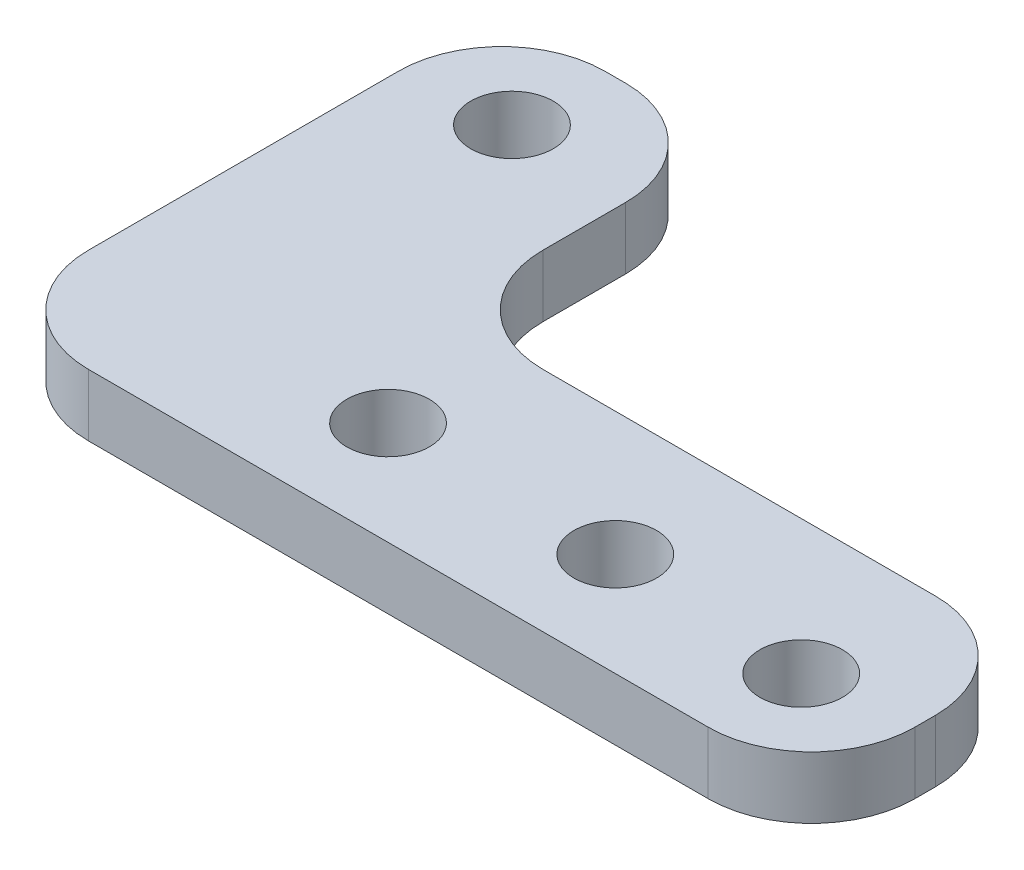
ISO-10303-21;
HEADER;
FILE_DESCRIPTION(('STEP AP214'),'2;1');
FILE_NAME('part.step','',(''),(''),'','','');
FILE_SCHEMA(('AUTOMOTIVE_DESIGN { 1 0 10303 214 1 1 1 1 }'));
ENDSEC;
DATA;
#1=APPLICATION_CONTEXT('core data for automotive mechanical design processes');
#2=APPLICATION_PROTOCOL_DEFINITION('international standard','automotive_design',2000,#1);
#3=PRODUCT_CONTEXT('',#1,'mechanical');
#4=PRODUCT('Part','Part','',(#3));
#5=PRODUCT_RELATED_PRODUCT_CATEGORY('part','',(#4));
#6=PRODUCT_DEFINITION_FORMATION('','',#4);
#7=PRODUCT_DEFINITION_CONTEXT('part definition',#1,'design');
#8=PRODUCT_DEFINITION('design','',#6,#7);
#9=PRODUCT_DEFINITION_SHAPE('','',#8);
#10=(LENGTH_UNIT() NAMED_UNIT(*) SI_UNIT(.MILLI.,.METRE.));
#11=(NAMED_UNIT(*) PLANE_ANGLE_UNIT() SI_UNIT($,.RADIAN.));
#12=(NAMED_UNIT(*) SI_UNIT($,.STERADIAN.) SOLID_ANGLE_UNIT());
#13=UNCERTAINTY_MEASURE_WITH_UNIT(LENGTH_MEASURE(1.E-05),#10,'distance_accuracy_value','');
#14=(GEOMETRIC_REPRESENTATION_CONTEXT(3) GLOBAL_UNCERTAINTY_ASSIGNED_CONTEXT((#13)) GLOBAL_UNIT_ASSIGNED_CONTEXT((#10,
#11,#12)) REPRESENTATION_CONTEXT('',''));
#15=CARTESIAN_POINT('',(0.,0.,0.));
#16=DIRECTION('',(0.,0.,1.));
#17=DIRECTION('',(1.,0.,0.));
#18=AXIS2_PLACEMENT_3D('',#15,#16,#17);
#19=CARTESIAN_POINT('',(-20.,3.,12.5));
#20=DIRECTION('',(1.,0.,0.));
#21=DIRECTION('',(0.,0.,-1.));
#22=AXIS2_PLACEMENT_3D('',#19,#20,#21);
#23=PLANE('',#22);
#24=DIRECTION('',(0.,0.,1.));
#25=VECTOR('',#24,1.);
#26=CARTESIAN_POINT('',(-20.,3.,12.5));
#27=LINE('',#26,#25);
#28=CARTESIAN_POINT('',(-20.,3.,-7.5));
#29=VERTEX_POINT('',#28);
#30=CARTESIAN_POINT('',(-20.,3.,7.50000000000001));
#31=VERTEX_POINT('',#30);
#32=EDGE_CURVE('E151',#29,#31,#27,.T.);
#33=ORIENTED_EDGE('',*,*,#32,.F.);
#34=DIRECTION('',(0.,-1.,0.));
#35=VECTOR('',#34,1.);
#36=CARTESIAN_POINT('',(-20.,3.,-7.5));
#37=LINE('',#36,#35);
#38=CARTESIAN_POINT('',(-20.,0.,-7.5));
#39=VERTEX_POINT('',#38);
#40=EDGE_CURVE('E185',#29,#39,#37,.T.);
#41=ORIENTED_EDGE('',*,*,#40,.T.);
#42=DIRECTION('',(0.,0.,1.));
#43=VECTOR('',#42,1.);
#44=CARTESIAN_POINT('',(-20.,0.,12.5));
#45=LINE('',#44,#43);
#46=CARTESIAN_POINT('',(-20.,0.,7.50000000000001));
#47=VERTEX_POINT('',#46);
#48=EDGE_CURVE('E153',#39,#47,#45,.T.);
#49=ORIENTED_EDGE('',*,*,#48,.T.);
#50=DIRECTION('',(0.,-1.,0.));
#51=VECTOR('',#50,1.);
#52=CARTESIAN_POINT('',(-20.,3.,7.50000000000001));
#53=LINE('',#52,#51);
#54=EDGE_CURVE('E183',#47,#31,#53,.F.);
#55=ORIENTED_EDGE('',*,*,#54,.T.);
#56=EDGE_LOOP('',(#33,#41,#49,#55));
#57=FACE_BOUND('',#56,.T.);
#58=ADVANCED_FACE('F33',(#57),#23,.F.);
#59=CARTESIAN_POINT('',(20.,3.,12.5));
#60=DIRECTION('',(0.,0.,-1.));
#61=DIRECTION('',(-1.,0.,0.));
#62=AXIS2_PLACEMENT_3D('',#59,#60,#61);
#63=PLANE('',#62);
#64=DIRECTION('',(1.,0.,0.));
#65=VECTOR('',#64,1.);
#66=CARTESIAN_POINT('',(20.,0.,12.5));
#67=LINE('',#66,#65);
#68=CARTESIAN_POINT('',(-15.,0.,12.5));
#69=VERTEX_POINT('',#68);
#70=CARTESIAN_POINT('',(15.,0.,12.5));
#71=VERTEX_POINT('',#70);
#72=EDGE_CURVE('E149',#69,#71,#67,.T.);
#73=ORIENTED_EDGE('',*,*,#72,.T.);
#74=DIRECTION('',(0.,-1.,0.));
#75=VECTOR('',#74,1.);
#76=CARTESIAN_POINT('',(15.,3.,12.5));
#77=LINE('',#76,#75);
#78=CARTESIAN_POINT('',(15.,3.,12.5));
#79=VERTEX_POINT('',#78);
#80=EDGE_CURVE('E127',#71,#79,#77,.F.);
#81=ORIENTED_EDGE('',*,*,#80,.T.);
#82=DIRECTION('',(1.,0.,0.));
#83=VECTOR('',#82,1.);
#84=CARTESIAN_POINT('',(20.,3.,12.5));
#85=LINE('',#84,#83);
#86=CARTESIAN_POINT('',(-15.,3.,12.5));
#87=VERTEX_POINT('',#86);
#88=EDGE_CURVE('E251',#87,#79,#85,.T.);
#89=ORIENTED_EDGE('',*,*,#88,.F.);
#90=DIRECTION('',(0.,-1.,0.));
#91=VECTOR('',#90,1.);
#92=CARTESIAN_POINT('',(-15.,3.,12.5));
#93=LINE('',#92,#91);
#94=EDGE_CURVE('E179',#87,#69,#93,.T.);
#95=ORIENTED_EDGE('',*,*,#94,.T.);
#96=EDGE_LOOP('',(#73,#81,#89,#95));
#97=FACE_BOUND('',#96,.T.);
#98=ADVANCED_FACE('F266',(#97),#63,.F.);
#99=CARTESIAN_POINT('',(20.,3.,12.5));
#100=DIRECTION('',(-1.,0.,0.));
#101=DIRECTION('',(0.,0.,1.));
#102=AXIS2_PLACEMENT_3D('',#99,#100,#101);
#103=PLANE('',#102);
#104=DIRECTION('',(0.,0.,-1.));
#105=VECTOR('',#104,1.);
#106=CARTESIAN_POINT('',(20.,0.,12.5));
#107=LINE('',#106,#105);
#108=CARTESIAN_POINT('',(20.,0.,7.5));
#109=VERTEX_POINT('',#108);
#110=CARTESIAN_POINT('',(20.,0.,6.50000000000001));
#111=VERTEX_POINT('',#110);
#112=EDGE_CURVE('E138',#109,#111,#107,.T.);
#113=ORIENTED_EDGE('',*,*,#112,.T.);
#114=DIRECTION('',(0.,1.,0.));
#115=VECTOR('',#114,1.);
#116=CARTESIAN_POINT('',(20.,3.,6.50000000000001));
#117=LINE('',#116,#115);
#118=CARTESIAN_POINT('',(20.,3.,6.50000000000001));
#119=VERTEX_POINT('',#118);
#120=EDGE_CURVE('E142',#111,#119,#117,.T.);
#121=ORIENTED_EDGE('',*,*,#120,.T.);
#122=DIRECTION('',(0.,0.,-1.));
#123=VECTOR('',#122,1.);
#124=CARTESIAN_POINT('',(20.,3.,12.5));
#125=LINE('',#124,#123);
#126=CARTESIAN_POINT('',(20.,3.,7.5));
#127=VERTEX_POINT('',#126);
#128=EDGE_CURVE('E141',#127,#119,#125,.T.);
#129=ORIENTED_EDGE('',*,*,#128,.F.);
#130=DIRECTION('',(0.,-1.,0.));
#131=VECTOR('',#130,1.);
#132=CARTESIAN_POINT('',(20.,3.,7.5));
#133=LINE('',#132,#131);
#134=EDGE_CURVE('E126',#127,#109,#133,.T.);
#135=ORIENTED_EDGE('',*,*,#134,.T.);
#136=EDGE_LOOP('',(#113,#121,#129,#135));
#137=FACE_BOUND('',#136,.T.);
#138=ADVANCED_FACE('F136',(#137),#103,.F.);
#139=CARTESIAN_POINT('',(20.,3.,-12.5));
#140=DIRECTION('',(0.,0.,1.));
#141=DIRECTION('',(1.,0.,0.));
#142=AXIS2_PLACEMENT_3D('',#139,#140,#141);
#143=PLANE('',#142);
#144=DIRECTION('',(-1.,0.,0.));
#145=VECTOR('',#144,1.);
#146=CARTESIAN_POINT('',(20.,0.,-12.5));
#147=LINE('',#146,#145);
#148=CARTESIAN_POINT('',(-14.,0.,-12.5));
#149=VERTEX_POINT('',#148);
#150=CARTESIAN_POINT('',(-15.,0.,-12.5));
#151=VERTEX_POINT('',#150);
#152=EDGE_CURVE('E148',#149,#151,#147,.T.);
#153=ORIENTED_EDGE('',*,*,#152,.T.);
#154=DIRECTION('',(0.,-1.,0.));
#155=VECTOR('',#154,1.);
#156=CARTESIAN_POINT('',(-15.,3.,-12.5));
#157=LINE('',#156,#155);
#158=CARTESIAN_POINT('',(-15.,3.,-12.5));
#159=VERTEX_POINT('',#158);
#160=EDGE_CURVE('E189',#151,#159,#157,.F.);
#161=ORIENTED_EDGE('',*,*,#160,.T.);
#162=DIRECTION('',(-1.,0.,0.));
#163=VECTOR('',#162,1.);
#164=CARTESIAN_POINT('',(20.,3.,-12.5));
#165=LINE('',#164,#163);
#166=CARTESIAN_POINT('',(-14.,3.,-12.5));
#167=VERTEX_POINT('',#166);
#168=EDGE_CURVE('E143',#167,#159,#165,.T.);
#169=ORIENTED_EDGE('',*,*,#168,.F.);
#170=DIRECTION('',(0.,1.,0.));
#171=VECTOR('',#170,1.);
#172=CARTESIAN_POINT('',(-14.,3.,-12.5));
#173=LINE('',#172,#171);
#174=EDGE_CURVE('E55',#167,#149,#173,.F.);
#175=ORIENTED_EDGE('',*,*,#174,.T.);
#176=EDGE_LOOP('',(#153,#161,#169,#175));
#177=FACE_BOUND('',#176,.T.);
#178=ADVANCED_FACE('F273',(#177),#143,.F.);
#179=CARTESIAN_POINT('',(0.,3.,0.));
#180=DIRECTION('',(0.,1.,0.));
#181=DIRECTION('',(0.,0.,1.));
#182=AXIS2_PLACEMENT_3D('',#179,#180,#181);
#183=PLANE('',#182);
#184=ORIENTED_EDGE('',*,*,#128,.T.);
#185=CARTESIAN_POINT('',(15.,3.,6.50000000000001));
#186=DIRECTION('',(0.,1.,0.));
#187=DIRECTION('',(0.,0.,1.));
#188=AXIS2_PLACEMENT_3D('',#185,#186,#187);
#189=CIRCLE('',#188,5.);
#190=CARTESIAN_POINT('',(15.,3.,1.5));
#191=VERTEX_POINT('',#190);
#192=EDGE_CURVE('E166',#119,#191,#189,.T.);
#193=ORIENTED_EDGE('',*,*,#192,.T.);
#194=DIRECTION('',(1.,0.,0.));
#195=VECTOR('',#194,1.);
#196=CARTESIAN_POINT('',(-9.,3.,1.50000000000001));
#197=LINE('',#196,#195);
#198=CARTESIAN_POINT('',(-4.,3.,1.50000000000001));
#199=VERTEX_POINT('',#198);
#200=EDGE_CURVE('E203',#199,#191,#197,.T.);
#201=ORIENTED_EDGE('',*,*,#200,.F.);
#202=CARTESIAN_POINT('',(-4.,3.,-3.49999999999999));
#203=DIRECTION('',(0.,1.,0.));
#204=DIRECTION('',(0.,0.,1.));
#205=AXIS2_PLACEMENT_3D('',#202,#203,#204);
#206=CIRCLE('',#205,5.);
#207=CARTESIAN_POINT('',(-9.,3.,-3.49999999999999));
#208=VERTEX_POINT('',#207);
#209=EDGE_CURVE('E41',#199,#208,#206,.F.);
#210=ORIENTED_EDGE('',*,*,#209,.T.);
#211=DIRECTION('',(0.,0.,1.));
#212=VECTOR('',#211,1.);
#213=CARTESIAN_POINT('',(-9.,3.,-12.5));
#214=LINE('',#213,#212);
#215=CARTESIAN_POINT('',(-9.,3.,-7.5));
#216=VERTEX_POINT('',#215);
#217=EDGE_CURVE('E201',#216,#208,#214,.T.);
#218=ORIENTED_EDGE('',*,*,#217,.F.);
#219=CARTESIAN_POINT('',(-14.,3.,-7.5));
#220=DIRECTION('',(0.,1.,0.));
#221=DIRECTION('',(0.,0.,1.));
#222=AXIS2_PLACEMENT_3D('',#219,#220,#221);
#223=CIRCLE('',#222,5.);
#224=EDGE_CURVE('E160',#216,#167,#223,.T.);
#225=ORIENTED_EDGE('',*,*,#224,.T.);
#226=ORIENTED_EDGE('',*,*,#168,.T.);
#227=CARTESIAN_POINT('',(-15.,3.,-7.5));
#228=DIRECTION('',(0.,1.,0.));
#229=DIRECTION('',(0.,0.,1.));
#230=AXIS2_PLACEMENT_3D('',#227,#228,#229);
#231=CIRCLE('',#230,5.);
#232=EDGE_CURVE('E162',#159,#29,#231,.T.);
#233=ORIENTED_EDGE('',*,*,#232,.T.);
#234=ORIENTED_EDGE('',*,*,#32,.T.);
#235=CARTESIAN_POINT('',(-15.,3.,7.50000000000001));
#236=DIRECTION('',(0.,1.,0.));
#237=DIRECTION('',(0.,0.,1.));
#238=AXIS2_PLACEMENT_3D('',#235,#236,#237);
#239=CIRCLE('',#238,5.);
#240=EDGE_CURVE('E158',#31,#87,#239,.T.);
#241=ORIENTED_EDGE('',*,*,#240,.T.);
#242=ORIENTED_EDGE('',*,*,#88,.T.);
#243=CARTESIAN_POINT('',(15.,3.,7.5));
#244=DIRECTION('',(0.,1.,0.));
#245=DIRECTION('',(0.,0.,1.));
#246=AXIS2_PLACEMENT_3D('',#243,#244,#245);
#247=CIRCLE('',#246,5.);
#248=EDGE_CURVE('E164',#79,#127,#247,.T.);
#249=ORIENTED_EDGE('',*,*,#248,.T.);
#250=EDGE_LOOP('',(#184,#193,#201,#210,#218,#225,#226,#233,#234,#241,#242,#249));
#251=FACE_BOUND('',#250,.T.);
#252=CARTESIAN_POINT('',(-5.5,3.,7.50000000000001));
#253=DIRECTION('',(0.,1.,0.));
#254=DIRECTION('',(0.,0.,1.));
#255=AXIS2_PLACEMENT_3D('',#252,#253,#254);
#256=CIRCLE('',#255,1.99999999999999);
#257=CARTESIAN_POINT('',(-5.5,3.,9.49999999999999));
#258=VERTEX_POINT('',#257);
#259=EDGE_CURVE('E221',#258,#258,#256,.T.);
#260=ORIENTED_EDGE('',*,*,#259,.F.);
#261=EDGE_LOOP('',(#260));
#262=FACE_BOUND('',#261,.T.);
#263=CARTESIAN_POINT('',(5.5,3.,7.50000000000001));
#264=DIRECTION('',(0.,1.,0.));
#265=DIRECTION('',(0.,0.,1.));
#266=AXIS2_PLACEMENT_3D('',#263,#264,#265);
#267=CIRCLE('',#266,1.99999999999999);
#268=CARTESIAN_POINT('',(5.5,3.,9.49999999999999));
#269=VERTEX_POINT('',#268);
#270=EDGE_CURVE('E231',#269,#269,#267,.T.);
#271=ORIENTED_EDGE('',*,*,#270,.F.);
#272=EDGE_LOOP('',(#271));
#273=FACE_BOUND('',#272,.T.);
#274=CARTESIAN_POINT('',(-15.,3.,-8.));
#275=DIRECTION('',(0.,1.,0.));
#276=DIRECTION('',(0.,0.,1.));
#277=AXIS2_PLACEMENT_3D('',#274,#275,#276);
#278=CIRCLE('',#277,1.99999999999999);
#279=CARTESIAN_POINT('',(-15.,3.,-6.00000000000001));
#280=VERTEX_POINT('',#279);
#281=EDGE_CURVE('E237',#280,#280,#278,.T.);
#282=ORIENTED_EDGE('',*,*,#281,.F.);
#283=EDGE_LOOP('',(#282));
#284=FACE_BOUND('',#283,.T.);
#285=CARTESIAN_POINT('',(15.,3.,8.));
#286=DIRECTION('',(0.,1.,0.));
#287=DIRECTION('',(0.,0.,1.));
#288=AXIS2_PLACEMENT_3D('',#285,#286,#287);
#289=CIRCLE('',#288,1.99999999999999);
#290=CARTESIAN_POINT('',(15.,3.,9.99999999999998));
#291=VERTEX_POINT('',#290);
#292=EDGE_CURVE('E243',#291,#291,#289,.T.);
#293=ORIENTED_EDGE('',*,*,#292,.F.);
#294=EDGE_LOOP('',(#293));
#295=FACE_BOUND('',#294,.T.);
#296=ADVANCED_FACE('F199',(#251,#262,#273,#284,#295),#183,.T.);
#297=CARTESIAN_POINT('',(0.,0.,0.));
#298=DIRECTION('',(0.,1.,0.));
#299=DIRECTION('',(0.,0.,1.));
#300=AXIS2_PLACEMENT_3D('',#297,#298,#299);
#301=PLANE('',#300);
#302=CARTESIAN_POINT('',(-5.5,0.,7.50000000000001));
#303=DIRECTION('',(0.,1.,0.));
#304=DIRECTION('',(0.,0.,1.));
#305=AXIS2_PLACEMENT_3D('',#302,#303,#304);
#306=CIRCLE('',#305,2.);
#307=CARTESIAN_POINT('',(-5.5,0.,9.50000000000001));
#308=VERTEX_POINT('',#307);
#309=EDGE_CURVE('E224',#308,#308,#306,.T.);
#310=ORIENTED_EDGE('',*,*,#309,.T.);
#311=EDGE_LOOP('',(#310));
#312=FACE_BOUND('',#311,.T.);
#313=CARTESIAN_POINT('',(5.5,0.,7.50000000000001));
#314=DIRECTION('',(0.,1.,0.));
#315=DIRECTION('',(0.,0.,1.));
#316=AXIS2_PLACEMENT_3D('',#313,#314,#315);
#317=CIRCLE('',#316,2.);
#318=CARTESIAN_POINT('',(5.5,0.,9.5));
#319=VERTEX_POINT('',#318);
#320=EDGE_CURVE('E234',#319,#319,#317,.T.);
#321=ORIENTED_EDGE('',*,*,#320,.T.);
#322=EDGE_LOOP('',(#321));
#323=FACE_BOUND('',#322,.T.);
#324=CARTESIAN_POINT('',(-15.,0.,-8.));
#325=DIRECTION('',(0.,1.,0.));
#326=DIRECTION('',(0.,0.,1.));
#327=AXIS2_PLACEMENT_3D('',#324,#325,#326);
#328=CIRCLE('',#327,2.);
#329=CARTESIAN_POINT('',(-15.,0.,-6.));
#330=VERTEX_POINT('',#329);
#331=EDGE_CURVE('E240',#330,#330,#328,.T.);
#332=ORIENTED_EDGE('',*,*,#331,.T.);
#333=EDGE_LOOP('',(#332));
#334=FACE_BOUND('',#333,.T.);
#335=CARTESIAN_POINT('',(15.,0.,8.));
#336=DIRECTION('',(0.,1.,0.));
#337=DIRECTION('',(0.,0.,1.));
#338=AXIS2_PLACEMENT_3D('',#335,#336,#337);
#339=CIRCLE('',#338,2.);
#340=CARTESIAN_POINT('',(15.,0.,10.));
#341=VERTEX_POINT('',#340);
#342=EDGE_CURVE('E246',#341,#341,#339,.T.);
#343=ORIENTED_EDGE('',*,*,#342,.T.);
#344=EDGE_LOOP('',(#343));
#345=FACE_BOUND('',#344,.T.);
#346=DIRECTION('',(1.,0.,0.));
#347=VECTOR('',#346,1.);
#348=CARTESIAN_POINT('',(-9.,0.,1.50000000000001));
#349=LINE('',#348,#347);
#350=CARTESIAN_POINT('',(-4.,0.,1.50000000000001));
#351=VERTEX_POINT('',#350);
#352=CARTESIAN_POINT('',(15.,0.,1.5));
#353=VERTEX_POINT('',#352);
#354=EDGE_CURVE('E216',#351,#353,#349,.T.);
#355=ORIENTED_EDGE('',*,*,#354,.T.);
#356=CARTESIAN_POINT('',(15.,0.,6.50000000000001));
#357=DIRECTION('',(0.,1.,0.));
#358=DIRECTION('',(0.,0.,1.));
#359=AXIS2_PLACEMENT_3D('',#356,#357,#358);
#360=CIRCLE('',#359,5.);
#361=EDGE_CURVE('E131',#353,#111,#360,.F.);
#362=ORIENTED_EDGE('',*,*,#361,.T.);
#363=ORIENTED_EDGE('',*,*,#112,.F.);
#364=CARTESIAN_POINT('',(15.,0.,7.5));
#365=DIRECTION('',(0.,1.,0.));
#366=DIRECTION('',(0.,0.,1.));
#367=AXIS2_PLACEMENT_3D('',#364,#365,#366);
#368=CIRCLE('',#367,5.);
#369=EDGE_CURVE('E122',#109,#71,#368,.F.);
#370=ORIENTED_EDGE('',*,*,#369,.T.);
#371=ORIENTED_EDGE('',*,*,#72,.F.);
#372=CARTESIAN_POINT('',(-15.,0.,7.50000000000001));
#373=DIRECTION('',(0.,1.,0.));
#374=DIRECTION('',(0.,0.,1.));
#375=AXIS2_PLACEMENT_3D('',#372,#373,#374);
#376=CIRCLE('',#375,5.);
#377=EDGE_CURVE('E173',#69,#47,#376,.F.);
#378=ORIENTED_EDGE('',*,*,#377,.T.);
#379=ORIENTED_EDGE('',*,*,#48,.F.);
#380=CARTESIAN_POINT('',(-15.,0.,-7.5));
#381=DIRECTION('',(0.,1.,0.));
#382=DIRECTION('',(0.,0.,1.));
#383=AXIS2_PLACEMENT_3D('',#380,#381,#382);
#384=CIRCLE('',#383,5.);
#385=EDGE_CURVE('E48',#39,#151,#384,.F.);
#386=ORIENTED_EDGE('',*,*,#385,.T.);
#387=ORIENTED_EDGE('',*,*,#152,.F.);
#388=CARTESIAN_POINT('',(-14.,0.,-7.5));
#389=DIRECTION('',(0.,1.,0.));
#390=DIRECTION('',(0.,0.,1.));
#391=AXIS2_PLACEMENT_3D('',#388,#389,#390);
#392=CIRCLE('',#391,5.);
#393=CARTESIAN_POINT('',(-9.,0.,-7.5));
#394=VERTEX_POINT('',#393);
#395=EDGE_CURVE('E175',#149,#394,#392,.F.);
#396=ORIENTED_EDGE('',*,*,#395,.T.);
#397=DIRECTION('',(0.,0.,1.));
#398=VECTOR('',#397,1.);
#399=CARTESIAN_POINT('',(-9.,0.,-12.5));
#400=LINE('',#399,#398);
#401=CARTESIAN_POINT('',(-9.,0.,-3.49999999999999));
#402=VERTEX_POINT('',#401);
#403=EDGE_CURVE('E217',#394,#402,#400,.T.);
#404=ORIENTED_EDGE('',*,*,#403,.T.);
#405=CARTESIAN_POINT('',(-4.,0.,-3.49999999999999));
#406=DIRECTION('',(0.,1.,0.));
#407=DIRECTION('',(0.,0.,1.));
#408=AXIS2_PLACEMENT_3D('',#405,#406,#407);
#409=CIRCLE('',#408,5.);
#410=EDGE_CURVE('E11',#402,#351,#409,.T.);
#411=ORIENTED_EDGE('',*,*,#410,.T.);
#412=EDGE_LOOP('',(#355,#362,#363,#370,#371,#378,#379,#386,#387,#396,#404,#411));
#413=FACE_BOUND('',#412,.T.);
#414=ADVANCED_FACE('F146',(#312,#323,#334,#345,#413),#301,.F.);
#415=CARTESIAN_POINT('',(15.,3.,8.));
#416=DIRECTION('',(0.,1.,0.));
#417=DIRECTION('',(0.,0.,1.));
#418=AXIS2_PLACEMENT_3D('',#415,#416,#417);
#419=CYLINDRICAL_SURFACE('',#418,1.99999999999999);
#420=ORIENTED_EDGE('',*,*,#342,.F.);
#421=EDGE_LOOP('',(#420));
#422=FACE_BOUND('',#421,.T.);
#423=ORIENTED_EDGE('',*,*,#292,.T.);
#424=EDGE_LOOP('',(#423));
#425=FACE_BOUND('',#424,.T.);
#426=ADVANCED_FACE('F347',(#422,#425),#419,.F.);
#427=CARTESIAN_POINT('',(-15.,3.,-8.));
#428=DIRECTION('',(0.,1.,0.));
#429=DIRECTION('',(0.,0.,1.));
#430=AXIS2_PLACEMENT_3D('',#427,#428,#429);
#431=CYLINDRICAL_SURFACE('',#430,1.99999999999999);
#432=ORIENTED_EDGE('',*,*,#331,.F.);
#433=EDGE_LOOP('',(#432));
#434=FACE_BOUND('',#433,.T.);
#435=ORIENTED_EDGE('',*,*,#281,.T.);
#436=EDGE_LOOP('',(#435));
#437=FACE_BOUND('',#436,.T.);
#438=ADVANCED_FACE('F393',(#434,#437),#431,.F.);
#439=CARTESIAN_POINT('',(5.5,3.,7.50000000000001));
#440=DIRECTION('',(0.,1.,0.));
#441=DIRECTION('',(0.,0.,1.));
#442=AXIS2_PLACEMENT_3D('',#439,#440,#441);
#443=CYLINDRICAL_SURFACE('',#442,1.99999999999999);
#444=ORIENTED_EDGE('',*,*,#320,.F.);
#445=EDGE_LOOP('',(#444));
#446=FACE_BOUND('',#445,.T.);
#447=ORIENTED_EDGE('',*,*,#270,.T.);
#448=EDGE_LOOP('',(#447));
#449=FACE_BOUND('',#448,.T.);
#450=ADVANCED_FACE('F383',(#446,#449),#443,.F.);
#451=CARTESIAN_POINT('',(-5.5,3.,7.50000000000001));
#452=DIRECTION('',(0.,1.,0.));
#453=DIRECTION('',(0.,0.,1.));
#454=AXIS2_PLACEMENT_3D('',#451,#452,#453);
#455=CYLINDRICAL_SURFACE('',#454,1.99999999999999);
#456=ORIENTED_EDGE('',*,*,#309,.F.);
#457=EDGE_LOOP('',(#456));
#458=FACE_BOUND('',#457,.T.);
#459=ORIENTED_EDGE('',*,*,#259,.T.);
#460=EDGE_LOOP('',(#459));
#461=FACE_BOUND('',#460,.T.);
#462=ADVANCED_FACE('F339',(#458,#461),#455,.F.);
#463=CARTESIAN_POINT('',(-9.,0.,1.50000000000001));
#464=DIRECTION('',(0.,0.,1.));
#465=DIRECTION('',(1.,0.,0.));
#466=AXIS2_PLACEMENT_3D('',#463,#464,#465);
#467=PLANE('',#466);
#468=ORIENTED_EDGE('',*,*,#200,.T.);
#469=DIRECTION('',(0.,1.,0.));
#470=VECTOR('',#469,1.);
#471=CARTESIAN_POINT('',(15.,0.,1.5));
#472=LINE('',#471,#470);
#473=EDGE_CURVE('E171',#191,#353,#472,.F.);
#474=ORIENTED_EDGE('',*,*,#473,.T.);
#475=ORIENTED_EDGE('',*,*,#354,.F.);
#476=DIRECTION('',(0.,1.,0.));
#477=VECTOR('',#476,1.);
#478=CARTESIAN_POINT('',(-4.,3.,1.50000000000001));
#479=LINE('',#478,#477);
#480=EDGE_CURVE('E168',#351,#199,#479,.T.);
#481=ORIENTED_EDGE('',*,*,#480,.T.);
#482=EDGE_LOOP('',(#468,#474,#475,#481));
#483=FACE_BOUND('',#482,.T.);
#484=ADVANCED_FACE('F219',(#483),#467,.F.);
#485=CARTESIAN_POINT('',(-9.,0.,-12.5));
#486=DIRECTION('',(-1.,0.,0.));
#487=DIRECTION('',(0.,0.,1.));
#488=AXIS2_PLACEMENT_3D('',#485,#486,#487);
#489=PLANE('',#488);
#490=ORIENTED_EDGE('',*,*,#403,.F.);
#491=DIRECTION('',(0.,1.,0.));
#492=VECTOR('',#491,1.);
#493=CARTESIAN_POINT('',(-9.,0.,-7.5));
#494=LINE('',#493,#492);
#495=EDGE_CURVE('E193',#394,#216,#494,.T.);
#496=ORIENTED_EDGE('',*,*,#495,.T.);
#497=ORIENTED_EDGE('',*,*,#217,.T.);
#498=DIRECTION('',(0.,1.,0.));
#499=VECTOR('',#498,1.);
#500=CARTESIAN_POINT('',(-9.,0.,-3.49999999999999));
#501=LINE('',#500,#499);
#502=EDGE_CURVE('E191',#208,#402,#501,.F.);
#503=ORIENTED_EDGE('',*,*,#502,.T.);
#504=EDGE_LOOP('',(#490,#496,#497,#503));
#505=FACE_BOUND('',#504,.T.);
#506=ADVANCED_FACE('F209',(#505),#489,.F.);
#507=CARTESIAN_POINT('',(15.,3.,6.50000000000001));
#508=DIRECTION('',(0.,1.,0.));
#509=DIRECTION('',(0.,0.,1.));
#510=AXIS2_PLACEMENT_3D('',#507,#508,#509);
#511=CYLINDRICAL_SURFACE('',#510,5.);
#512=ORIENTED_EDGE('',*,*,#361,.F.);
#513=ORIENTED_EDGE('',*,*,#473,.F.);
#514=ORIENTED_EDGE('',*,*,#192,.F.);
#515=ORIENTED_EDGE('',*,*,#120,.F.);
#516=EDGE_LOOP('',(#512,#513,#514,#515));
#517=FACE_BOUND('',#516,.T.);
#518=ADVANCED_FACE('F278',(#517),#511,.T.);
#519=CARTESIAN_POINT('',(15.,3.,7.5));
#520=DIRECTION('',(0.,-1.,0.));
#521=DIRECTION('',(0.,0.,-1.));
#522=AXIS2_PLACEMENT_3D('',#519,#520,#521);
#523=CYLINDRICAL_SURFACE('',#522,5.);
#524=ORIENTED_EDGE('',*,*,#248,.F.);
#525=ORIENTED_EDGE('',*,*,#80,.F.);
#526=ORIENTED_EDGE('',*,*,#369,.F.);
#527=ORIENTED_EDGE('',*,*,#134,.F.);
#528=EDGE_LOOP('',(#524,#525,#526,#527));
#529=FACE_BOUND('',#528,.T.);
#530=ADVANCED_FACE('F125',(#529),#523,.T.);
#531=CARTESIAN_POINT('',(-15.,3.,-7.5));
#532=DIRECTION('',(0.,-1.,0.));
#533=DIRECTION('',(0.,0.,-1.));
#534=AXIS2_PLACEMENT_3D('',#531,#532,#533);
#535=CYLINDRICAL_SURFACE('',#534,5.);
#536=ORIENTED_EDGE('',*,*,#232,.F.);
#537=ORIENTED_EDGE('',*,*,#160,.F.);
#538=ORIENTED_EDGE('',*,*,#385,.F.);
#539=ORIENTED_EDGE('',*,*,#40,.F.);
#540=EDGE_LOOP('',(#536,#537,#538,#539));
#541=FACE_BOUND('',#540,.T.);
#542=ADVANCED_FACE('F284',(#541),#535,.T.);
#543=CARTESIAN_POINT('',(-14.,0.,-7.5));
#544=DIRECTION('',(0.,1.,0.));
#545=DIRECTION('',(0.,0.,1.));
#546=AXIS2_PLACEMENT_3D('',#543,#544,#545);
#547=CYLINDRICAL_SURFACE('',#546,5.);
#548=ORIENTED_EDGE('',*,*,#395,.F.);
#549=ORIENTED_EDGE('',*,*,#174,.F.);
#550=ORIENTED_EDGE('',*,*,#224,.F.);
#551=ORIENTED_EDGE('',*,*,#495,.F.);
#552=EDGE_LOOP('',(#548,#549,#550,#551));
#553=FACE_BOUND('',#552,.T.);
#554=ADVANCED_FACE('F287',(#553),#547,.T.);
#555=CARTESIAN_POINT('',(-4.,0.,-3.49999999999999));
#556=DIRECTION('',(0.,-1.,0.));
#557=DIRECTION('',(0.,0.,-1.));
#558=AXIS2_PLACEMENT_3D('',#555,#556,#557);
#559=CYLINDRICAL_SURFACE('',#558,5.);
#560=ORIENTED_EDGE('',*,*,#410,.F.);
#561=ORIENTED_EDGE('',*,*,#502,.F.);
#562=ORIENTED_EDGE('',*,*,#209,.F.);
#563=ORIENTED_EDGE('',*,*,#480,.F.);
#564=EDGE_LOOP('',(#560,#561,#562,#563));
#565=FACE_BOUND('',#564,.T.);
#566=ADVANCED_FACE('F214',(#565),#559,.F.);
#567=CARTESIAN_POINT('',(-15.,3.,7.50000000000001));
#568=DIRECTION('',(0.,-1.,0.));
#569=DIRECTION('',(0.,0.,-1.));
#570=AXIS2_PLACEMENT_3D('',#567,#568,#569);
#571=CYLINDRICAL_SURFACE('',#570,5.);
#572=ORIENTED_EDGE('',*,*,#240,.F.);
#573=ORIENTED_EDGE('',*,*,#54,.F.);
#574=ORIENTED_EDGE('',*,*,#377,.F.);
#575=ORIENTED_EDGE('',*,*,#94,.F.);
#576=EDGE_LOOP('',(#572,#573,#574,#575));
#577=FACE_BOUND('',#576,.T.);
#578=ADVANCED_FACE('F35',(#577),#571,.T.);
#579=CLOSED_SHELL('',(#58,#98,#138,#178,#296,#414,#426,#438,#450,#462,#484,#506,#518,#530,#542,
#554,#566,#578));
#580=MANIFOLD_SOLID_BREP('B2',#579);
#581=ADVANCED_BREP_SHAPE_REPRESENTATION('',(#18,#580),#14);
#582=SHAPE_DEFINITION_REPRESENTATION(#9,#581);
ENDSEC;
END-ISO-10303-21;
